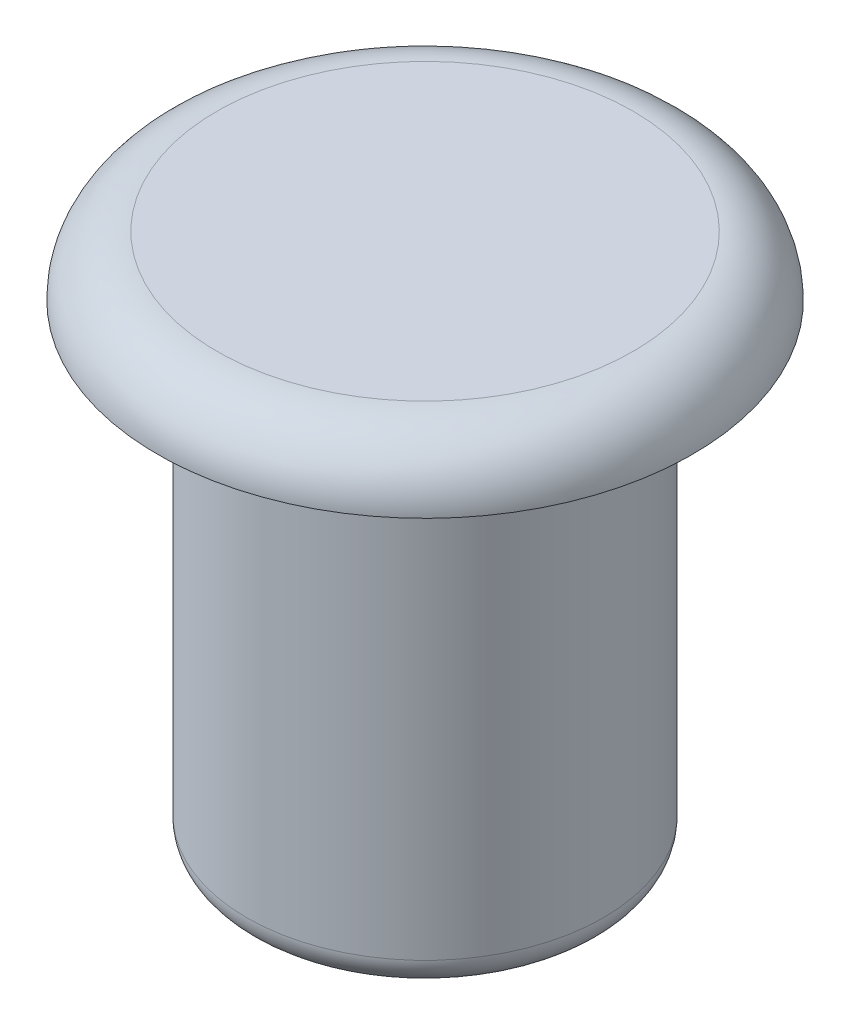
ISO-10303-21;
HEADER;
FILE_DESCRIPTION(('STEP AP214'),'2;1');
FILE_NAME('part.step','',(''),(''),'','','');
FILE_SCHEMA(('AUTOMOTIVE_DESIGN { 1 0 10303 214 1 1 1 1 }'));
ENDSEC;
DATA;
#1=APPLICATION_CONTEXT('core data for automotive mechanical design processes');
#2=APPLICATION_PROTOCOL_DEFINITION('international standard','automotive_design',2000,#1);
#3=PRODUCT_CONTEXT('',#1,'mechanical');
#4=PRODUCT('Part','Part','',(#3));
#5=PRODUCT_RELATED_PRODUCT_CATEGORY('part','',(#4));
#6=PRODUCT_DEFINITION_FORMATION('','',#4);
#7=PRODUCT_DEFINITION_CONTEXT('part definition',#1,'design');
#8=PRODUCT_DEFINITION('design','',#6,#7);
#9=PRODUCT_DEFINITION_SHAPE('','',#8);
#10=(LENGTH_UNIT() NAMED_UNIT(*) SI_UNIT(.MILLI.,.METRE.));
#11=(NAMED_UNIT(*) PLANE_ANGLE_UNIT() SI_UNIT($,.RADIAN.));
#12=(NAMED_UNIT(*) SI_UNIT($,.STERADIAN.) SOLID_ANGLE_UNIT());
#13=UNCERTAINTY_MEASURE_WITH_UNIT(LENGTH_MEASURE(1.E-05),#10,'distance_accuracy_value','');
#14=(GEOMETRIC_REPRESENTATION_CONTEXT(3) GLOBAL_UNCERTAINTY_ASSIGNED_CONTEXT((#13)) GLOBAL_UNIT_ASSIGNED_CONTEXT((#10,
#11,#12)) REPRESENTATION_CONTEXT('',''));
#15=CARTESIAN_POINT('',(0.,0.,0.));
#16=DIRECTION('',(0.,0.,1.));
#17=DIRECTION('',(1.,0.,0.));
#18=AXIS2_PLACEMENT_3D('',#15,#16,#17);
#19=CARTESIAN_POINT('',(0.,9.,0.));
#20=DIRECTION('',(0.,-1.,0.));
#21=DIRECTION('',(0.,0.,-1.));
#22=AXIS2_PLACEMENT_3D('',#19,#20,#21);
#23=PLANE('',#22);
#24=CARTESIAN_POINT('',(0.,9.,0.));
#25=DIRECTION('',(0.,-1.,0.));
#26=DIRECTION('',(0.,0.,-1.));
#27=AXIS2_PLACEMENT_3D('',#24,#25,#26);
#28=CIRCLE('',#27,3.5);
#29=CARTESIAN_POINT('',(0.,9.,-3.5));
#30=VERTEX_POINT('',#29);
#31=EDGE_CURVE('E10',#30,#30,#28,.T.);
#32=ORIENTED_EDGE('',*,*,#31,.F.);
#33=EDGE_LOOP('',(#32));
#34=FACE_BOUND('',#33,.T.);
#35=ADVANCED_FACE('F37',(#34),#23,.F.);
#36=CARTESIAN_POINT('',(0.,8.,0.));
#37=DIRECTION('',(0.,-1.,0.));
#38=DIRECTION('',(0.,0.,-1.));
#39=AXIS2_PLACEMENT_3D('',#36,#37,#38);
#40=TOROIDAL_SURFACE('',#39,3.5,0.999999999999999);
#41=CARTESIAN_POINT('',(0.,8.,0.));
#42=DIRECTION('',(0.,-1.,0.));
#43=DIRECTION('',(0.,0.,-1.));
#44=AXIS2_PLACEMENT_3D('',#41,#42,#43);
#45=CIRCLE('',#44,4.5);
#46=CARTESIAN_POINT('',(0.,8.,-4.5));
#47=VERTEX_POINT('',#46);
#48=EDGE_CURVE('E43',#47,#47,#45,.T.);
#49=ORIENTED_EDGE('',*,*,#48,.F.);
#50=EDGE_LOOP('',(#49));
#51=FACE_BOUND('',#50,.T.);
#52=ORIENTED_EDGE('',*,*,#31,.T.);
#53=EDGE_LOOP('',(#52));
#54=FACE_BOUND('',#53,.T.);
#55=ADVANCED_FACE('F76',(#51,#54),#40,.T.);
#56=CARTESIAN_POINT('',(0.,8.,4.5));
#57=DIRECTION('',(0.,1.,0.));
#58=DIRECTION('',(0.,0.,1.));
#59=AXIS2_PLACEMENT_3D('',#56,#57,#58);
#60=PLANE('',#59);
#61=CARTESIAN_POINT('',(0.,8.,0.));
#62=DIRECTION('',(0.,-1.,0.));
#63=DIRECTION('',(0.,0.,-1.));
#64=AXIS2_PLACEMENT_3D('',#61,#62,#63);
#65=CIRCLE('',#64,3.);
#66=CARTESIAN_POINT('',(0.,8.,-3.));
#67=VERTEX_POINT('',#66);
#68=EDGE_CURVE('E47',#67,#67,#65,.T.);
#69=ORIENTED_EDGE('',*,*,#68,.F.);
#70=EDGE_LOOP('',(#69));
#71=FACE_BOUND('',#70,.T.);
#72=ORIENTED_EDGE('',*,*,#48,.T.);
#73=EDGE_LOOP('',(#72));
#74=FACE_BOUND('',#73,.T.);
#75=ADVANCED_FACE('F71',(#71,#74),#60,.F.);
#76=CARTESIAN_POINT('',(0.,0.,0.));
#77=DIRECTION('',(0.,-1.,0.));
#78=DIRECTION('',(0.,0.,-1.));
#79=AXIS2_PLACEMENT_3D('',#76,#77,#78);
#80=CYLINDRICAL_SURFACE('',#79,3.);
#81=CARTESIAN_POINT('',(0.,0.5,0.));
#82=DIRECTION('',(0.,-1.,0.));
#83=DIRECTION('',(0.,0.,-1.));
#84=AXIS2_PLACEMENT_3D('',#81,#82,#83);
#85=CIRCLE('',#84,3.);
#86=CARTESIAN_POINT('',(0.,0.5,-3.));
#87=VERTEX_POINT('',#86);
#88=EDGE_CURVE('E51',#87,#87,#85,.T.);
#89=ORIENTED_EDGE('',*,*,#88,.F.);
#90=EDGE_LOOP('',(#89));
#91=FACE_BOUND('',#90,.T.);
#92=ORIENTED_EDGE('',*,*,#68,.T.);
#93=EDGE_LOOP('',(#92));
#94=FACE_BOUND('',#93,.T.);
#95=ADVANCED_FACE('F65',(#91,#94),#80,.T.);
#96=CARTESIAN_POINT('',(0.,0.5,0.));
#97=DIRECTION('',(0.,-1.,0.));
#98=DIRECTION('',(0.,0.,-1.));
#99=AXIS2_PLACEMENT_3D('',#96,#97,#98);
#100=TOROIDAL_SURFACE('',#99,2.5,0.5);
#101=CARTESIAN_POINT('',(0.,0.,0.));
#102=DIRECTION('',(0.,-1.,0.));
#103=DIRECTION('',(0.,0.,-1.));
#104=AXIS2_PLACEMENT_3D('',#101,#102,#103);
#105=CIRCLE('',#104,2.5);
#106=CARTESIAN_POINT('',(0.,0.,-2.5));
#107=VERTEX_POINT('',#106);
#108=EDGE_CURVE('E56',#107,#107,#105,.T.);
#109=ORIENTED_EDGE('',*,*,#108,.F.);
#110=EDGE_LOOP('',(#109));
#111=FACE_BOUND('',#110,.T.);
#112=ORIENTED_EDGE('',*,*,#88,.T.);
#113=EDGE_LOOP('',(#112));
#114=FACE_BOUND('',#113,.T.);
#115=ADVANCED_FACE('F62',(#111,#114),#100,.T.);
#116=CARTESIAN_POINT('',(0.,0.,2.5));
#117=DIRECTION('',(0.,1.,0.));
#118=DIRECTION('',(0.,0.,1.));
#119=AXIS2_PLACEMENT_3D('',#116,#117,#118);
#120=PLANE('',#119);
#121=ORIENTED_EDGE('',*,*,#108,.T.);
#122=EDGE_LOOP('',(#121));
#123=FACE_BOUND('',#122,.T.);
#124=ADVANCED_FACE('F60',(#123),#120,.F.);
#125=CLOSED_SHELL('',(#35,#55,#75,#95,#115,#124));
#126=MANIFOLD_SOLID_BREP('B2',#125);
#127=ADVANCED_BREP_SHAPE_REPRESENTATION('',(#18,#126),#14);
#128=SHAPE_DEFINITION_REPRESENTATION(#9,#127);
ENDSEC;
END-ISO-10303-21;
